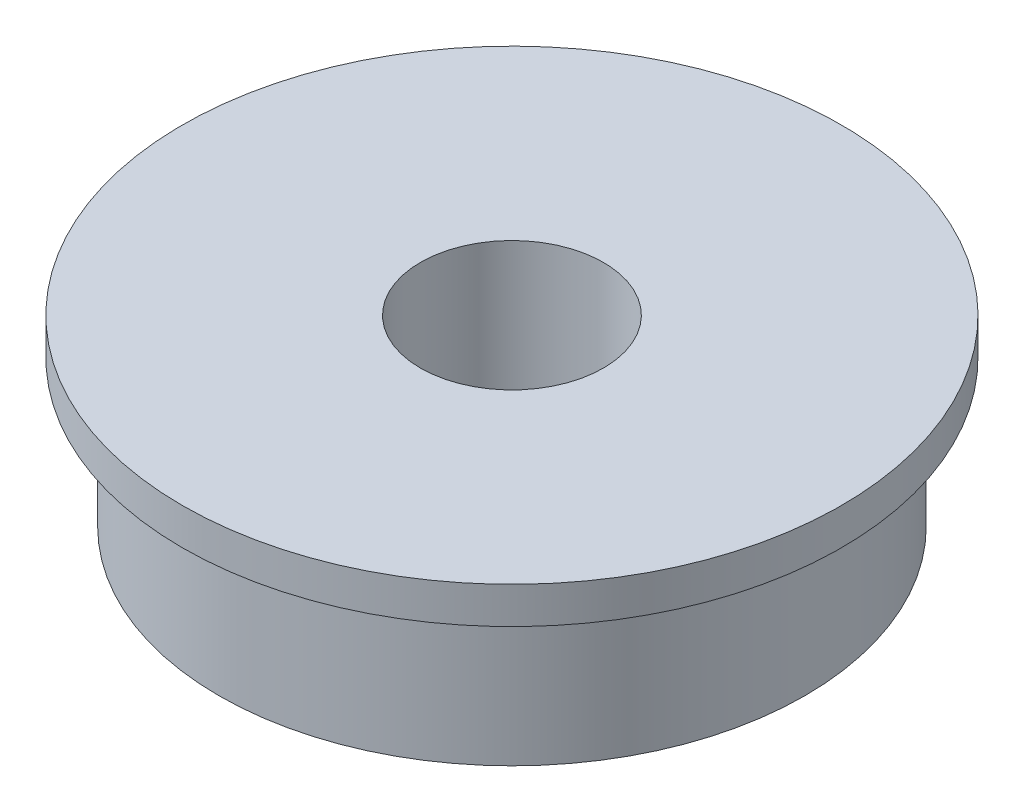
ISO-10303-21;
HEADER;
FILE_DESCRIPTION(('STEP AP214'),'2;1');
FILE_NAME('part.step','',(''),(''),'','','');
FILE_SCHEMA(('AUTOMOTIVE_DESIGN { 1 0 10303 214 1 1 1 1 }'));
ENDSEC;
DATA;
#1=APPLICATION_CONTEXT('core data for automotive mechanical design processes');
#2=APPLICATION_PROTOCOL_DEFINITION('international standard','automotive_design',2000,#1);
#3=PRODUCT_CONTEXT('',#1,'mechanical');
#4=PRODUCT('Part','Part','',(#3));
#5=PRODUCT_RELATED_PRODUCT_CATEGORY('part','',(#4));
#6=PRODUCT_DEFINITION_FORMATION('','',#4);
#7=PRODUCT_DEFINITION_CONTEXT('part definition',#1,'design');
#8=PRODUCT_DEFINITION('design','',#6,#7);
#9=PRODUCT_DEFINITION_SHAPE('','',#8);
#10=(LENGTH_UNIT() NAMED_UNIT(*) SI_UNIT(.MILLI.,.METRE.));
#11=(NAMED_UNIT(*) PLANE_ANGLE_UNIT() SI_UNIT($,.RADIAN.));
#12=(NAMED_UNIT(*) SI_UNIT($,.STERADIAN.) SOLID_ANGLE_UNIT());
#13=UNCERTAINTY_MEASURE_WITH_UNIT(LENGTH_MEASURE(1.E-05),#10,'distance_accuracy_value','');
#14=(GEOMETRIC_REPRESENTATION_CONTEXT(3) GLOBAL_UNCERTAINTY_ASSIGNED_CONTEXT((#13)) GLOBAL_UNIT_ASSIGNED_CONTEXT((#10,
#11,#12)) REPRESENTATION_CONTEXT('',''));
#15=CARTESIAN_POINT('',(0.,0.,0.));
#16=DIRECTION('',(0.,0.,1.));
#17=DIRECTION('',(1.,0.,0.));
#18=AXIS2_PLACEMENT_3D('',#15,#16,#17);
#19=CARTESIAN_POINT('',(0.,0.,0.));
#20=DIRECTION('',(0.,1.,0.));
#21=DIRECTION('',(0.,0.,1.));
#22=AXIS2_PLACEMENT_3D('',#19,#20,#21);
#23=PLANE('',#22);
#24=CARTESIAN_POINT('',(0.,0.,0.));
#25=DIRECTION('',(0.,1.,0.));
#26=DIRECTION('',(0.,0.,1.));
#27=AXIS2_PLACEMENT_3D('',#24,#25,#26);
#28=CIRCLE('',#27,8.);
#29=CARTESIAN_POINT('',(0.,0.,8.));
#30=VERTEX_POINT('',#29);
#31=EDGE_CURVE('E34',#30,#30,#28,.T.);
#32=ORIENTED_EDGE('',*,*,#31,.F.);
#33=EDGE_LOOP('',(#32));
#34=FACE_BOUND('',#33,.T.);
#35=CARTESIAN_POINT('',(0.,0.,0.));
#36=DIRECTION('',(0.,1.,0.));
#37=DIRECTION('',(0.,0.,1.));
#38=AXIS2_PLACEMENT_3D('',#35,#36,#37);
#39=CIRCLE('',#38,2.5);
#40=CARTESIAN_POINT('',(0.,0.,2.5));
#41=VERTEX_POINT('',#40);
#42=EDGE_CURVE('E41',#41,#41,#39,.T.);
#43=ORIENTED_EDGE('',*,*,#42,.T.);
#44=EDGE_LOOP('',(#43));
#45=FACE_BOUND('',#44,.T.);
#46=ADVANCED_FACE('F30',(#34,#45),#23,.F.);
#47=CARTESIAN_POINT('',(0.,4.,0.));
#48=DIRECTION('',(0.,-1.,0.));
#49=DIRECTION('',(0.,0.,-1.));
#50=AXIS2_PLACEMENT_3D('',#47,#48,#49);
#51=CYLINDRICAL_SURFACE('',#50,8.);
#52=CARTESIAN_POINT('',(0.,4.,0.));
#53=DIRECTION('',(0.,1.,0.));
#54=DIRECTION('',(0.,0.,1.));
#55=AXIS2_PLACEMENT_3D('',#52,#53,#54);
#56=CIRCLE('',#55,8.);
#57=CARTESIAN_POINT('',(0.,4.,8.));
#58=VERTEX_POINT('',#57);
#59=EDGE_CURVE('E10',#58,#58,#56,.T.);
#60=ORIENTED_EDGE('',*,*,#59,.F.);
#61=EDGE_LOOP('',(#60));
#62=FACE_BOUND('',#61,.T.);
#63=ORIENTED_EDGE('',*,*,#31,.T.);
#64=EDGE_LOOP('',(#63));
#65=FACE_BOUND('',#64,.T.);
#66=ADVANCED_FACE('F32',(#62,#65),#51,.T.);
#67=CARTESIAN_POINT('',(0.,4.,0.));
#68=DIRECTION('',(0.,-1.,0.));
#69=DIRECTION('',(0.,0.,-1.));
#70=AXIS2_PLACEMENT_3D('',#67,#68,#69);
#71=CYLINDRICAL_SURFACE('',#70,2.5);
#72=ORIENTED_EDGE('',*,*,#42,.F.);
#73=EDGE_LOOP('',(#72));
#74=FACE_BOUND('',#73,.T.);
#75=CARTESIAN_POINT('',(0.,5.,0.));
#76=DIRECTION('',(0.,1.,0.));
#77=DIRECTION('',(0.,0.,1.));
#78=AXIS2_PLACEMENT_3D('',#75,#76,#77);
#79=CIRCLE('',#78,2.5);
#80=CARTESIAN_POINT('',(0.,5.,2.5));
#81=VERTEX_POINT('',#80);
#82=EDGE_CURVE('E49',#81,#81,#79,.T.);
#83=ORIENTED_EDGE('',*,*,#82,.T.);
#84=EDGE_LOOP('',(#83));
#85=FACE_BOUND('',#84,.T.);
#86=ADVANCED_FACE('F55',(#74,#85),#71,.F.);
#87=CARTESIAN_POINT('',(0.,5.,0.));
#88=DIRECTION('',(0.,1.,0.));
#89=DIRECTION('',(0.,0.,1.));
#90=AXIS2_PLACEMENT_3D('',#87,#88,#89);
#91=PLANE('',#90);
#92=CARTESIAN_POINT('',(0.,5.,0.));
#93=DIRECTION('',(0.,1.,0.));
#94=DIRECTION('',(0.,0.,1.));
#95=AXIS2_PLACEMENT_3D('',#92,#93,#94);
#96=CIRCLE('',#95,9.);
#97=CARTESIAN_POINT('',(0.,5.,9.));
#98=VERTEX_POINT('',#97);
#99=EDGE_CURVE('E45',#98,#98,#96,.T.);
#100=ORIENTED_EDGE('',*,*,#99,.T.);
#101=EDGE_LOOP('',(#100));
#102=FACE_BOUND('',#101,.T.);
#103=ORIENTED_EDGE('',*,*,#82,.F.);
#104=EDGE_LOOP('',(#103));
#105=FACE_BOUND('',#104,.T.);
#106=ADVANCED_FACE('F57',(#102,#105),#91,.T.);
#107=CARTESIAN_POINT('',(0.,4.,0.));
#108=DIRECTION('',(0.,1.,0.));
#109=DIRECTION('',(0.,0.,1.));
#110=AXIS2_PLACEMENT_3D('',#107,#108,#109);
#111=PLANE('',#110);
#112=ORIENTED_EDGE('',*,*,#59,.T.);
#113=EDGE_LOOP('',(#112));
#114=FACE_BOUND('',#113,.T.);
#115=CARTESIAN_POINT('',(0.,4.,0.));
#116=DIRECTION('',(0.,1.,0.));
#117=DIRECTION('',(0.,0.,1.));
#118=AXIS2_PLACEMENT_3D('',#115,#116,#117);
#119=CIRCLE('',#118,9.);
#120=CARTESIAN_POINT('',(0.,4.,9.));
#121=VERTEX_POINT('',#120);
#122=EDGE_CURVE('E46',#121,#121,#119,.T.);
#123=ORIENTED_EDGE('',*,*,#122,.F.);
#124=EDGE_LOOP('',(#123));
#125=FACE_BOUND('',#124,.T.);
#126=ADVANCED_FACE('F59',(#114,#125),#111,.F.);
#127=CARTESIAN_POINT('',(0.,5.,0.));
#128=DIRECTION('',(0.,-1.,0.));
#129=DIRECTION('',(0.,0.,-1.));
#130=AXIS2_PLACEMENT_3D('',#127,#128,#129);
#131=CYLINDRICAL_SURFACE('',#130,9.);
#132=ORIENTED_EDGE('',*,*,#99,.F.);
#133=EDGE_LOOP('',(#132));
#134=FACE_BOUND('',#133,.T.);
#135=ORIENTED_EDGE('',*,*,#122,.T.);
#136=EDGE_LOOP('',(#135));
#137=FACE_BOUND('',#136,.T.);
#138=ADVANCED_FACE('F66',(#134,#137),#131,.T.);
#139=CLOSED_SHELL('',(#46,#66,#86,#106,#126,#138));
#140=MANIFOLD_SOLID_BREP('B2',#139);
#141=ADVANCED_BREP_SHAPE_REPRESENTATION('',(#18,#140),#14);
#142=SHAPE_DEFINITION_REPRESENTATION(#9,#141);
ENDSEC;
END-ISO-10303-21;
